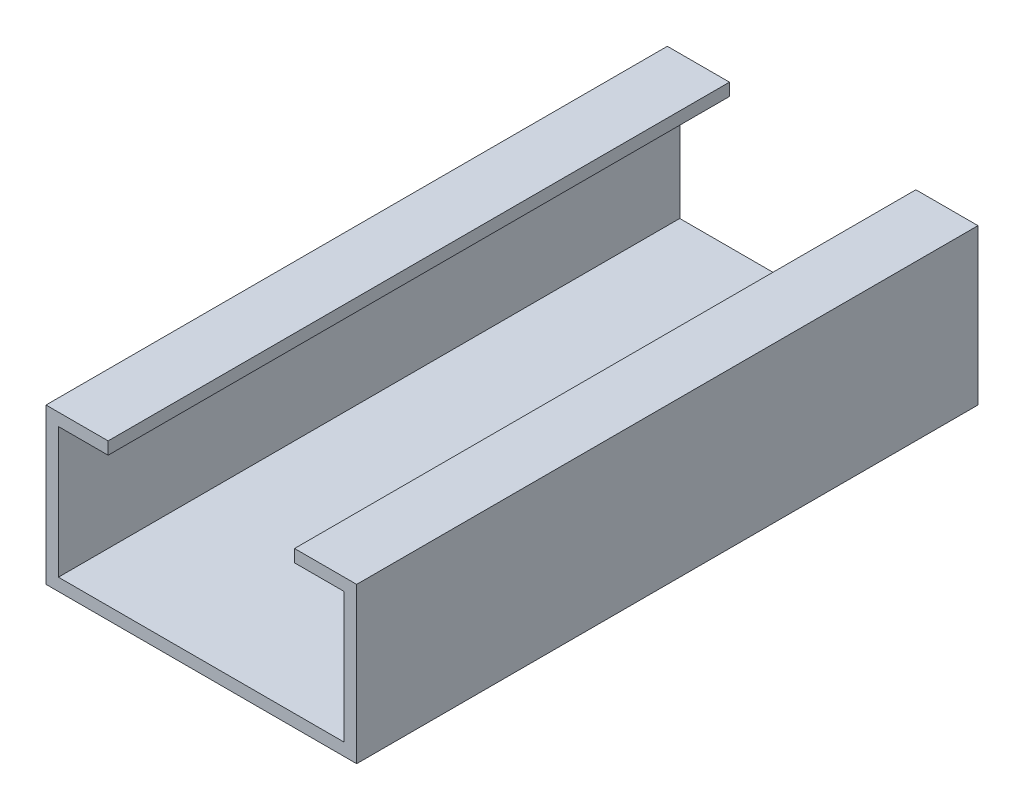
ISO-10303-21;
HEADER;
FILE_DESCRIPTION(('STEP AP214'),'2;1');
FILE_NAME('part.step','',(''),(''),'','','');
FILE_SCHEMA(('AUTOMOTIVE_DESIGN { 1 0 10303 214 1 1 1 1 }'));
ENDSEC;
DATA;
#1=APPLICATION_CONTEXT('core data for automotive mechanical design processes');
#2=APPLICATION_PROTOCOL_DEFINITION('international standard','automotive_design',2000,#1);
#3=PRODUCT_CONTEXT('',#1,'mechanical');
#4=PRODUCT('Part','Part','',(#3));
#5=PRODUCT_RELATED_PRODUCT_CATEGORY('part','',(#4));
#6=PRODUCT_DEFINITION_FORMATION('','',#4);
#7=PRODUCT_DEFINITION_CONTEXT('part definition',#1,'design');
#8=PRODUCT_DEFINITION('design','',#6,#7);
#9=PRODUCT_DEFINITION_SHAPE('','',#8);
#10=(LENGTH_UNIT() NAMED_UNIT(*) SI_UNIT(.MILLI.,.METRE.));
#11=(NAMED_UNIT(*) PLANE_ANGLE_UNIT() SI_UNIT($,.RADIAN.));
#12=(NAMED_UNIT(*) SI_UNIT($,.STERADIAN.) SOLID_ANGLE_UNIT());
#13=UNCERTAINTY_MEASURE_WITH_UNIT(LENGTH_MEASURE(1.E-05),#10,'distance_accuracy_value','');
#14=(GEOMETRIC_REPRESENTATION_CONTEXT(3) GLOBAL_UNCERTAINTY_ASSIGNED_CONTEXT((#13)) GLOBAL_UNIT_ASSIGNED_CONTEXT((#10,
#11,#12)) REPRESENTATION_CONTEXT('',''));
#15=CARTESIAN_POINT('',(0.,0.,0.));
#16=DIRECTION('',(0.,0.,1.));
#17=DIRECTION('',(1.,0.,0.));
#18=AXIS2_PLACEMENT_3D('',#15,#16,#17);
#19=CARTESIAN_POINT('',(50.,-25.,200.));
#20=DIRECTION('',(-1.,0.,0.));
#21=DIRECTION('',(0.,0.,1.));
#22=AXIS2_PLACEMENT_3D('',#19,#20,#21);
#23=PLANE('',#22);
#24=DIRECTION('',(0.,1.,0.));
#25=VECTOR('',#24,1.);
#26=CARTESIAN_POINT('',(50.,-25.,0.));
#27=LINE('',#26,#25);
#28=CARTESIAN_POINT('',(50.,-25.,0.));
#29=VERTEX_POINT('',#28);
#30=CARTESIAN_POINT('',(50.,25.,0.));
#31=VERTEX_POINT('',#30);
#32=EDGE_CURVE('E164',#29,#31,#27,.T.);
#33=ORIENTED_EDGE('',*,*,#32,.T.);
#34=DIRECTION('',(0.,0.,-1.));
#35=VECTOR('',#34,1.);
#36=CARTESIAN_POINT('',(50.,25.,200.));
#37=LINE('',#36,#35);
#38=CARTESIAN_POINT('',(50.,25.,200.));
#39=VERTEX_POINT('',#38);
#40=EDGE_CURVE('E11',#39,#31,#37,.T.);
#41=ORIENTED_EDGE('',*,*,#40,.F.);
#42=DIRECTION('',(0.,1.,0.));
#43=VECTOR('',#42,1.);
#44=CARTESIAN_POINT('',(50.,-25.,200.));
#45=LINE('',#44,#43);
#46=CARTESIAN_POINT('',(50.,-25.,200.));
#47=VERTEX_POINT('',#46);
#48=EDGE_CURVE('E198',#47,#39,#45,.T.);
#49=ORIENTED_EDGE('',*,*,#48,.F.);
#50=DIRECTION('',(0.,0.,-1.));
#51=VECTOR('',#50,1.);
#52=CARTESIAN_POINT('',(50.,-25.,200.));
#53=LINE('',#52,#51);
#54=EDGE_CURVE('E160',#47,#29,#53,.T.);
#55=ORIENTED_EDGE('',*,*,#54,.T.);
#56=EDGE_LOOP('',(#33,#41,#49,#55));
#57=FACE_BOUND('',#56,.T.);
#58=ADVANCED_FACE('F39',(#57),#23,.F.);
#59=CARTESIAN_POINT('',(50.,25.,200.));
#60=DIRECTION('',(0.,-1.,0.));
#61=DIRECTION('',(0.,0.,-1.));
#62=AXIS2_PLACEMENT_3D('',#59,#60,#61);
#63=PLANE('',#62);
#64=DIRECTION('',(-1.,0.,0.));
#65=VECTOR('',#64,1.);
#66=CARTESIAN_POINT('',(50.,25.,0.));
#67=LINE('',#66,#65);
#68=CARTESIAN_POINT('',(30.,25.,0.));
#69=VERTEX_POINT('',#68);
#70=EDGE_CURVE('E168',#31,#69,#67,.T.);
#71=ORIENTED_EDGE('',*,*,#70,.T.);
#72=DIRECTION('',(0.,0.,-1.));
#73=VECTOR('',#72,1.);
#74=CARTESIAN_POINT('',(30.,25.,200.));
#75=LINE('',#74,#73);
#76=CARTESIAN_POINT('',(30.,25.,200.));
#77=VERTEX_POINT('',#76);
#78=EDGE_CURVE('E48',#77,#69,#75,.T.);
#79=ORIENTED_EDGE('',*,*,#78,.F.);
#80=DIRECTION('',(-1.,0.,0.));
#81=VECTOR('',#80,1.);
#82=CARTESIAN_POINT('',(50.,25.,200.));
#83=LINE('',#82,#81);
#84=EDGE_CURVE('E111',#39,#77,#83,.T.);
#85=ORIENTED_EDGE('',*,*,#84,.F.);
#86=ORIENTED_EDGE('',*,*,#40,.T.);
#87=EDGE_LOOP('',(#71,#79,#85,#86));
#88=FACE_BOUND('',#87,.T.);
#89=ADVANCED_FACE('F292',(#88),#63,.F.);
#90=CARTESIAN_POINT('',(30.,25.,200.));
#91=DIRECTION('',(1.,0.,0.));
#92=DIRECTION('',(0.,0.,-1.));
#93=AXIS2_PLACEMENT_3D('',#90,#91,#92);
#94=PLANE('',#93);
#95=DIRECTION('',(0.,-1.,0.));
#96=VECTOR('',#95,1.);
#97=CARTESIAN_POINT('',(30.,25.,0.));
#98=LINE('',#97,#96);
#99=CARTESIAN_POINT('',(30.,21.,0.));
#100=VERTEX_POINT('',#99);
#101=EDGE_CURVE('E171',#69,#100,#98,.T.);
#102=ORIENTED_EDGE('',*,*,#101,.T.);
#103=DIRECTION('',(0.,0.,-1.));
#104=VECTOR('',#103,1.);
#105=CARTESIAN_POINT('',(30.,21.,200.));
#106=LINE('',#105,#104);
#107=CARTESIAN_POINT('',(30.,21.,200.));
#108=VERTEX_POINT('',#107);
#109=EDGE_CURVE('E225',#108,#100,#106,.T.);
#110=ORIENTED_EDGE('',*,*,#109,.F.);
#111=DIRECTION('',(0.,-1.,0.));
#112=VECTOR('',#111,1.);
#113=CARTESIAN_POINT('',(30.,25.,200.));
#114=LINE('',#113,#112);
#115=EDGE_CURVE('E235',#77,#108,#114,.T.);
#116=ORIENTED_EDGE('',*,*,#115,.F.);
#117=ORIENTED_EDGE('',*,*,#78,.T.);
#118=EDGE_LOOP('',(#102,#110,#116,#117));
#119=FACE_BOUND('',#118,.T.);
#120=ADVANCED_FACE('F233',(#119),#94,.F.);
#121=CARTESIAN_POINT('',(30.,21.,200.));
#122=DIRECTION('',(0.,1.,0.));
#123=DIRECTION('',(0.,0.,1.));
#124=AXIS2_PLACEMENT_3D('',#121,#122,#123);
#125=PLANE('',#124);
#126=DIRECTION('',(1.,0.,0.));
#127=VECTOR('',#126,1.);
#128=CARTESIAN_POINT('',(30.,21.,0.));
#129=LINE('',#128,#127);
#130=CARTESIAN_POINT('',(46.,21.,0.));
#131=VERTEX_POINT('',#130);
#132=EDGE_CURVE('E174',#100,#131,#129,.T.);
#133=ORIENTED_EDGE('',*,*,#132,.T.);
#134=DIRECTION('',(0.,0.,-1.));
#135=VECTOR('',#134,1.);
#136=CARTESIAN_POINT('',(46.,21.,200.));
#137=LINE('',#136,#135);
#138=CARTESIAN_POINT('',(46.,21.,200.));
#139=VERTEX_POINT('',#138);
#140=EDGE_CURVE('E221',#139,#131,#137,.T.);
#141=ORIENTED_EDGE('',*,*,#140,.F.);
#142=DIRECTION('',(1.,0.,0.));
#143=VECTOR('',#142,1.);
#144=CARTESIAN_POINT('',(30.,21.,200.));
#145=LINE('',#144,#143);
#146=EDGE_CURVE('E254',#108,#139,#145,.T.);
#147=ORIENTED_EDGE('',*,*,#146,.F.);
#148=ORIENTED_EDGE('',*,*,#109,.T.);
#149=EDGE_LOOP('',(#133,#141,#147,#148));
#150=FACE_BOUND('',#149,.T.);
#151=ADVANCED_FACE('F244',(#150),#125,.F.);
#152=CARTESIAN_POINT('',(46.,21.,200.));
#153=DIRECTION('',(1.,0.,0.));
#154=DIRECTION('',(0.,1.,0.));
#155=AXIS2_PLACEMENT_3D('',#152,#153,#154);
#156=PLANE('',#155);
#157=DIRECTION('',(0.,-1.,0.));
#158=VECTOR('',#157,1.);
#159=CARTESIAN_POINT('',(46.,21.,0.));
#160=LINE('',#159,#158);
#161=CARTESIAN_POINT('',(46.,-21.,0.));
#162=VERTEX_POINT('',#161);
#163=EDGE_CURVE('E177',#131,#162,#160,.T.);
#164=ORIENTED_EDGE('',*,*,#163,.T.);
#165=DIRECTION('',(0.,0.,-1.));
#166=VECTOR('',#165,1.);
#167=CARTESIAN_POINT('',(46.,-21.,200.));
#168=LINE('',#167,#166);
#169=CARTESIAN_POINT('',(46.,-21.,200.));
#170=VERTEX_POINT('',#169);
#171=EDGE_CURVE('E217',#170,#162,#168,.T.);
#172=ORIENTED_EDGE('',*,*,#171,.F.);
#173=DIRECTION('',(0.,-1.,0.));
#174=VECTOR('',#173,1.);
#175=CARTESIAN_POINT('',(46.,21.,200.));
#176=LINE('',#175,#174);
#177=EDGE_CURVE('E250',#139,#170,#176,.T.);
#178=ORIENTED_EDGE('',*,*,#177,.F.);
#179=ORIENTED_EDGE('',*,*,#140,.T.);
#180=EDGE_LOOP('',(#164,#172,#178,#179));
#181=FACE_BOUND('',#180,.T.);
#182=ADVANCED_FACE('F248',(#181),#156,.F.);
#183=CARTESIAN_POINT('',(46.,-21.,200.));
#184=DIRECTION('',(0.,-1.,0.));
#185=DIRECTION('',(1.,0.,0.));
#186=AXIS2_PLACEMENT_3D('',#183,#184,#185);
#187=PLANE('',#186);
#188=DIRECTION('',(-1.,0.,0.));
#189=VECTOR('',#188,1.);
#190=CARTESIAN_POINT('',(46.,-21.,0.));
#191=LINE('',#190,#189);
#192=CARTESIAN_POINT('',(-46.,-21.,0.));
#193=VERTEX_POINT('',#192);
#194=EDGE_CURVE('E180',#162,#193,#191,.T.);
#195=ORIENTED_EDGE('',*,*,#194,.T.);
#196=DIRECTION('',(0.,0.,-1.));
#197=VECTOR('',#196,1.);
#198=CARTESIAN_POINT('',(-46.,-21.,200.));
#199=LINE('',#198,#197);
#200=CARTESIAN_POINT('',(-46.,-21.,200.));
#201=VERTEX_POINT('',#200);
#202=EDGE_CURVE('E213',#201,#193,#199,.T.);
#203=ORIENTED_EDGE('',*,*,#202,.F.);
#204=DIRECTION('',(-1.,0.,0.));
#205=VECTOR('',#204,1.);
#206=CARTESIAN_POINT('',(46.,-21.,200.));
#207=LINE('',#206,#205);
#208=EDGE_CURVE('E253',#170,#201,#207,.T.);
#209=ORIENTED_EDGE('',*,*,#208,.F.);
#210=ORIENTED_EDGE('',*,*,#171,.T.);
#211=EDGE_LOOP('',(#195,#203,#209,#210));
#212=FACE_BOUND('',#211,.T.);
#213=ADVANCED_FACE('F305',(#212),#187,.F.);
#214=CARTESIAN_POINT('',(-46.,-21.,200.));
#215=DIRECTION('',(-1.,0.,0.));
#216=DIRECTION('',(0.,0.,1.));
#217=AXIS2_PLACEMENT_3D('',#214,#215,#216);
#218=PLANE('',#217);
#219=DIRECTION('',(0.,1.,0.));
#220=VECTOR('',#219,1.);
#221=CARTESIAN_POINT('',(-46.,-21.,0.));
#222=LINE('',#221,#220);
#223=CARTESIAN_POINT('',(-46.,21.,0.));
#224=VERTEX_POINT('',#223);
#225=EDGE_CURVE('E183',#193,#224,#222,.T.);
#226=ORIENTED_EDGE('',*,*,#225,.T.);
#227=DIRECTION('',(0.,0.,-1.));
#228=VECTOR('',#227,1.);
#229=CARTESIAN_POINT('',(-46.,21.,200.));
#230=LINE('',#229,#228);
#231=CARTESIAN_POINT('',(-46.,21.,200.));
#232=VERTEX_POINT('',#231);
#233=EDGE_CURVE('E209',#232,#224,#230,.T.);
#234=ORIENTED_EDGE('',*,*,#233,.F.);
#235=DIRECTION('',(0.,1.,0.));
#236=VECTOR('',#235,1.);
#237=CARTESIAN_POINT('',(-46.,-21.,200.));
#238=LINE('',#237,#236);
#239=EDGE_CURVE('E258',#201,#232,#238,.T.);
#240=ORIENTED_EDGE('',*,*,#239,.F.);
#241=ORIENTED_EDGE('',*,*,#202,.T.);
#242=EDGE_LOOP('',(#226,#234,#240,#241));
#243=FACE_BOUND('',#242,.T.);
#244=ADVANCED_FACE('F308',(#243),#218,.F.);
#245=CARTESIAN_POINT('',(-46.,21.,200.));
#246=DIRECTION('',(0.,1.,0.));
#247=DIRECTION('',(0.,0.,1.));
#248=AXIS2_PLACEMENT_3D('',#245,#246,#247);
#249=PLANE('',#248);
#250=DIRECTION('',(1.,0.,0.));
#251=VECTOR('',#250,1.);
#252=CARTESIAN_POINT('',(-46.,21.,0.));
#253=LINE('',#252,#251);
#254=CARTESIAN_POINT('',(-30.,21.,0.));
#255=VERTEX_POINT('',#254);
#256=EDGE_CURVE('E186',#224,#255,#253,.T.);
#257=ORIENTED_EDGE('',*,*,#256,.T.);
#258=DIRECTION('',(0.,0.,-1.));
#259=VECTOR('',#258,1.);
#260=CARTESIAN_POINT('',(-30.,21.,200.));
#261=LINE('',#260,#259);
#262=CARTESIAN_POINT('',(-30.,21.,200.));
#263=VERTEX_POINT('',#262);
#264=EDGE_CURVE('E205',#263,#255,#261,.T.);
#265=ORIENTED_EDGE('',*,*,#264,.F.);
#266=DIRECTION('',(1.,0.,0.));
#267=VECTOR('',#266,1.);
#268=CARTESIAN_POINT('',(-46.,21.,200.));
#269=LINE('',#268,#267);
#270=EDGE_CURVE('E265',#232,#263,#269,.T.);
#271=ORIENTED_EDGE('',*,*,#270,.F.);
#272=ORIENTED_EDGE('',*,*,#233,.T.);
#273=EDGE_LOOP('',(#257,#265,#271,#272));
#274=FACE_BOUND('',#273,.T.);
#275=ADVANCED_FACE('F273',(#274),#249,.F.);
#276=CARTESIAN_POINT('',(-30.,21.,200.));
#277=DIRECTION('',(-1.,0.,0.));
#278=DIRECTION('',(0.,0.,1.));
#279=AXIS2_PLACEMENT_3D('',#276,#277,#278);
#280=PLANE('',#279);
#281=DIRECTION('',(0.,1.,0.));
#282=VECTOR('',#281,1.);
#283=CARTESIAN_POINT('',(-30.,21.,0.));
#284=LINE('',#283,#282);
#285=CARTESIAN_POINT('',(-30.,25.,0.));
#286=VERTEX_POINT('',#285);
#287=EDGE_CURVE('E189',#255,#286,#284,.T.);
#288=ORIENTED_EDGE('',*,*,#287,.T.);
#289=DIRECTION('',(0.,0.,-1.));
#290=VECTOR('',#289,1.);
#291=CARTESIAN_POINT('',(-30.,25.,200.));
#292=LINE('',#291,#290);
#293=CARTESIAN_POINT('',(-30.,25.,200.));
#294=VERTEX_POINT('',#293);
#295=EDGE_CURVE('E153',#294,#286,#292,.T.);
#296=ORIENTED_EDGE('',*,*,#295,.F.);
#297=DIRECTION('',(0.,1.,0.));
#298=VECTOR('',#297,1.);
#299=CARTESIAN_POINT('',(-30.,21.,200.));
#300=LINE('',#299,#298);
#301=EDGE_CURVE('E142',#263,#294,#300,.T.);
#302=ORIENTED_EDGE('',*,*,#301,.F.);
#303=ORIENTED_EDGE('',*,*,#264,.T.);
#304=EDGE_LOOP('',(#288,#296,#302,#303));
#305=FACE_BOUND('',#304,.T.);
#306=ADVANCED_FACE('F277',(#305),#280,.F.);
#307=CARTESIAN_POINT('',(-30.,25.,200.));
#308=DIRECTION('',(0.,-1.,0.));
#309=DIRECTION('',(0.,0.,-1.));
#310=AXIS2_PLACEMENT_3D('',#307,#308,#309);
#311=PLANE('',#310);
#312=DIRECTION('',(-1.,0.,0.));
#313=VECTOR('',#312,1.);
#314=CARTESIAN_POINT('',(-30.,25.,0.));
#315=LINE('',#314,#313);
#316=CARTESIAN_POINT('',(-50.,25.,0.));
#317=VERTEX_POINT('',#316);
#318=EDGE_CURVE('E151',#286,#317,#315,.T.);
#319=ORIENTED_EDGE('',*,*,#318,.T.);
#320=DIRECTION('',(0.,0.,-1.));
#321=VECTOR('',#320,1.);
#322=CARTESIAN_POINT('',(-50.,25.,200.));
#323=LINE('',#322,#321);
#324=CARTESIAN_POINT('',(-50.,25.,200.));
#325=VERTEX_POINT('',#324);
#326=EDGE_CURVE('E148',#325,#317,#323,.T.);
#327=ORIENTED_EDGE('',*,*,#326,.F.);
#328=DIRECTION('',(-1.,0.,0.));
#329=VECTOR('',#328,1.);
#330=CARTESIAN_POINT('',(-30.,25.,200.));
#331=LINE('',#330,#329);
#332=EDGE_CURVE('E136',#294,#325,#331,.T.);
#333=ORIENTED_EDGE('',*,*,#332,.F.);
#334=ORIENTED_EDGE('',*,*,#295,.T.);
#335=EDGE_LOOP('',(#319,#327,#333,#334));
#336=FACE_BOUND('',#335,.T.);
#337=ADVANCED_FACE('F149',(#336),#311,.F.);
#338=CARTESIAN_POINT('',(-50.,25.,200.));
#339=DIRECTION('',(1.,0.,0.));
#340=DIRECTION('',(0.,1.,0.));
#341=AXIS2_PLACEMENT_3D('',#338,#339,#340);
#342=PLANE('',#341);
#343=DIRECTION('',(0.,-1.,0.));
#344=VECTOR('',#343,1.);
#345=CARTESIAN_POINT('',(-50.,25.,0.));
#346=LINE('',#345,#344);
#347=CARTESIAN_POINT('',(-50.,-25.,0.));
#348=VERTEX_POINT('',#347);
#349=EDGE_CURVE('E97',#317,#348,#346,.T.);
#350=ORIENTED_EDGE('',*,*,#349,.T.);
#351=DIRECTION('',(0.,0.,-1.));
#352=VECTOR('',#351,1.);
#353=CARTESIAN_POINT('',(-50.,-25.,200.));
#354=LINE('',#353,#352);
#355=CARTESIAN_POINT('',(-50.,-25.,200.));
#356=VERTEX_POINT('',#355);
#357=EDGE_CURVE('E154',#356,#348,#354,.T.);
#358=ORIENTED_EDGE('',*,*,#357,.F.);
#359=DIRECTION('',(0.,-1.,0.));
#360=VECTOR('',#359,1.);
#361=CARTESIAN_POINT('',(-50.,25.,200.));
#362=LINE('',#361,#360);
#363=EDGE_CURVE('E140',#325,#356,#362,.T.);
#364=ORIENTED_EDGE('',*,*,#363,.F.);
#365=ORIENTED_EDGE('',*,*,#326,.T.);
#366=EDGE_LOOP('',(#350,#358,#364,#365));
#367=FACE_BOUND('',#366,.T.);
#368=ADVANCED_FACE('F156',(#367),#342,.F.);
#369=CARTESIAN_POINT('',(-50.,-25.,200.));
#370=DIRECTION('',(0.,1.,0.));
#371=DIRECTION('',(0.,0.,1.));
#372=AXIS2_PLACEMENT_3D('',#369,#370,#371);
#373=PLANE('',#372);
#374=DIRECTION('',(1.,0.,0.));
#375=VECTOR('',#374,1.);
#376=CARTESIAN_POINT('',(-50.,-25.,0.));
#377=LINE('',#376,#375);
#378=EDGE_CURVE('E103',#348,#29,#377,.T.);
#379=ORIENTED_EDGE('',*,*,#378,.T.);
#380=ORIENTED_EDGE('',*,*,#54,.F.);
#381=DIRECTION('',(1.,0.,0.));
#382=VECTOR('',#381,1.);
#383=CARTESIAN_POINT('',(-50.,-25.,200.));
#384=LINE('',#383,#382);
#385=EDGE_CURVE('E56',#356,#47,#384,.T.);
#386=ORIENTED_EDGE('',*,*,#385,.F.);
#387=ORIENTED_EDGE('',*,*,#357,.T.);
#388=EDGE_LOOP('',(#379,#380,#386,#387));
#389=FACE_BOUND('',#388,.T.);
#390=ADVANCED_FACE('F281',(#389),#373,.F.);
#391=CARTESIAN_POINT('',(0.,0.,200.));
#392=DIRECTION('',(0.,0.,1.));
#393=DIRECTION('',(1.,0.,0.));
#394=AXIS2_PLACEMENT_3D('',#391,#392,#393);
#395=PLANE('',#394);
#396=ORIENTED_EDGE('',*,*,#48,.T.);
#397=ORIENTED_EDGE('',*,*,#84,.T.);
#398=ORIENTED_EDGE('',*,*,#115,.T.);
#399=ORIENTED_EDGE('',*,*,#146,.T.);
#400=ORIENTED_EDGE('',*,*,#177,.T.);
#401=ORIENTED_EDGE('',*,*,#208,.T.);
#402=ORIENTED_EDGE('',*,*,#239,.T.);
#403=ORIENTED_EDGE('',*,*,#270,.T.);
#404=ORIENTED_EDGE('',*,*,#301,.T.);
#405=ORIENTED_EDGE('',*,*,#332,.T.);
#406=ORIENTED_EDGE('',*,*,#363,.T.);
#407=ORIENTED_EDGE('',*,*,#385,.T.);
#408=EDGE_LOOP('',(#396,#397,#398,#399,#400,#401,#402,#403,#404,#405,#406,#407));
#409=FACE_BOUND('',#408,.T.);
#410=ADVANCED_FACE('F138',(#409),#395,.T.);
#411=CARTESIAN_POINT('',(0.,0.,0.));
#412=DIRECTION('',(0.,0.,1.));
#413=DIRECTION('',(1.,0.,0.));
#414=AXIS2_PLACEMENT_3D('',#411,#412,#413);
#415=PLANE('',#414);
#416=ORIENTED_EDGE('',*,*,#32,.F.);
#417=ORIENTED_EDGE('',*,*,#378,.F.);
#418=ORIENTED_EDGE('',*,*,#349,.F.);
#419=ORIENTED_EDGE('',*,*,#318,.F.);
#420=ORIENTED_EDGE('',*,*,#287,.F.);
#421=ORIENTED_EDGE('',*,*,#256,.F.);
#422=ORIENTED_EDGE('',*,*,#225,.F.);
#423=ORIENTED_EDGE('',*,*,#194,.F.);
#424=ORIENTED_EDGE('',*,*,#163,.F.);
#425=ORIENTED_EDGE('',*,*,#132,.F.);
#426=ORIENTED_EDGE('',*,*,#101,.F.);
#427=ORIENTED_EDGE('',*,*,#70,.F.);
#428=EDGE_LOOP('',(#416,#417,#418,#419,#420,#421,#422,#423,#424,#425,#426,#427));
#429=FACE_BOUND('',#428,.T.);
#430=ADVANCED_FACE('F239',(#429),#415,.F.);
#431=CLOSED_SHELL('',(#58,#89,#120,#151,#182,#213,#244,#275,#306,#337,#368,#390,#410,#430));
#432=MANIFOLD_SOLID_BREP('B2',#431);
#433=ADVANCED_BREP_SHAPE_REPRESENTATION('',(#18,#432),#14);
#434=SHAPE_DEFINITION_REPRESENTATION(#9,#433);
ENDSEC;
END-ISO-10303-21;
